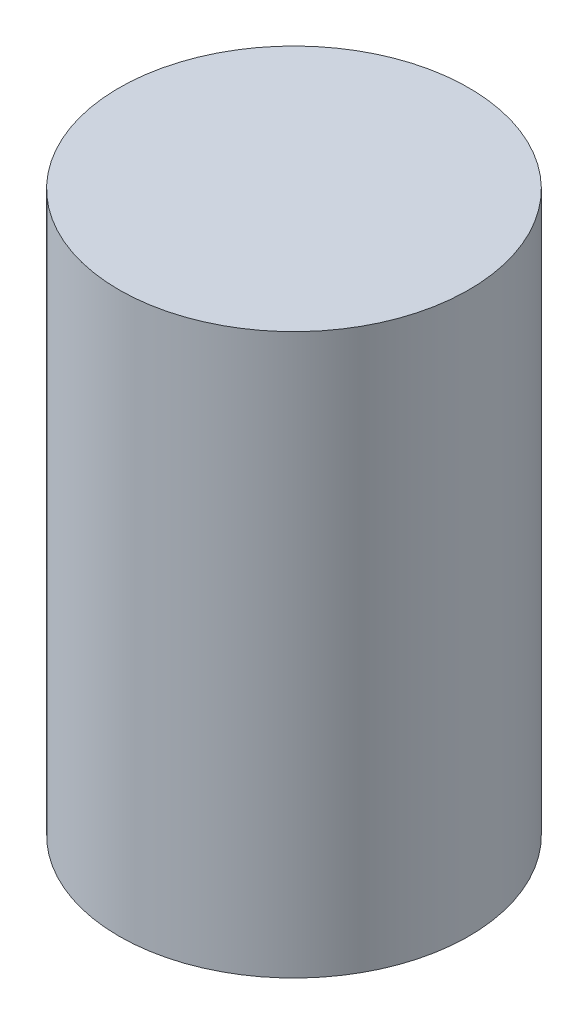
ISO-10303-21;
HEADER;
FILE_DESCRIPTION(('STEP AP214'),'2;1');
FILE_NAME('part.step','',(''),(''),'','','');
FILE_SCHEMA(('AUTOMOTIVE_DESIGN { 1 0 10303 214 1 1 1 1 }'));
ENDSEC;
DATA;
#1=APPLICATION_CONTEXT('core data for automotive mechanical design processes');
#2=APPLICATION_PROTOCOL_DEFINITION('international standard','automotive_design',2000,#1);
#3=PRODUCT_CONTEXT('',#1,'mechanical');
#4=PRODUCT('Part','Part','',(#3));
#5=PRODUCT_RELATED_PRODUCT_CATEGORY('part','',(#4));
#6=PRODUCT_DEFINITION_FORMATION('','',#4);
#7=PRODUCT_DEFINITION_CONTEXT('part definition',#1,'design');
#8=PRODUCT_DEFINITION('design','',#6,#7);
#9=PRODUCT_DEFINITION_SHAPE('','',#8);
#10=(LENGTH_UNIT() NAMED_UNIT(*) SI_UNIT(.MILLI.,.METRE.));
#11=(NAMED_UNIT(*) PLANE_ANGLE_UNIT() SI_UNIT($,.RADIAN.));
#12=(NAMED_UNIT(*) SI_UNIT($,.STERADIAN.) SOLID_ANGLE_UNIT());
#13=UNCERTAINTY_MEASURE_WITH_UNIT(LENGTH_MEASURE(1.E-05),#10,'distance_accuracy_value','');
#14=(GEOMETRIC_REPRESENTATION_CONTEXT(3) GLOBAL_UNCERTAINTY_ASSIGNED_CONTEXT((#13)) GLOBAL_UNIT_ASSIGNED_CONTEXT((#10,
#11,#12)) REPRESENTATION_CONTEXT('',''));
#15=CARTESIAN_POINT('',(0.,0.,0.));
#16=DIRECTION('',(0.,0.,1.));
#17=DIRECTION('',(1.,0.,0.));
#18=AXIS2_PLACEMENT_3D('',#15,#16,#17);
#19=CARTESIAN_POINT('',(0.,80.,0.));
#20=DIRECTION('',(0.,-1.,0.));
#21=DIRECTION('',(0.,0.,-1.));
#22=AXIS2_PLACEMENT_3D('',#19,#20,#21);
#23=CYLINDRICAL_SURFACE('',#22,25.);
#24=CARTESIAN_POINT('',(0.,80.,0.));
#25=DIRECTION('',(0.,1.,0.));
#26=DIRECTION('',(0.,0.,1.));
#27=AXIS2_PLACEMENT_3D('',#24,#25,#26);
#28=CIRCLE('',#27,25.);
#29=CARTESIAN_POINT('',(0.,80.,25.));
#30=VERTEX_POINT('',#29);
#31=EDGE_CURVE('E48',#30,#30,#28,.T.);
#32=ORIENTED_EDGE('',*,*,#31,.F.);
#33=EDGE_LOOP('',(#32));
#34=FACE_BOUND('',#33,.T.);
#35=CARTESIAN_POINT('',(0.,0.,0.));
#36=DIRECTION('',(0.,1.,0.));
#37=DIRECTION('',(0.,0.,1.));
#38=AXIS2_PLACEMENT_3D('',#35,#36,#37);
#39=CIRCLE('',#38,25.);
#40=CARTESIAN_POINT('',(0.,0.,25.));
#41=VERTEX_POINT('',#40);
#42=EDGE_CURVE('E53',#41,#41,#39,.T.);
#43=ORIENTED_EDGE('',*,*,#42,.T.);
#44=EDGE_LOOP('',(#43));
#45=FACE_BOUND('',#44,.T.);
#46=ADVANCED_FACE('F41',(#34,#45),#23,.T.);
#47=CARTESIAN_POINT('',(0.,80.,0.));
#48=DIRECTION('',(0.,1.,0.));
#49=DIRECTION('',(0.,0.,1.));
#50=AXIS2_PLACEMENT_3D('',#47,#48,#49);
#51=PLANE('',#50);
#52=ORIENTED_EDGE('',*,*,#31,.T.);
#53=EDGE_LOOP('',(#52));
#54=FACE_BOUND('',#53,.T.);
#55=ADVANCED_FACE('F84',(#54),#51,.T.);
#56=CARTESIAN_POINT('',(0.,0.,0.));
#57=DIRECTION('',(0.,1.,0.));
#58=DIRECTION('',(0.,0.,1.));
#59=AXIS2_PLACEMENT_3D('',#56,#57,#58);
#60=PLANE('',#59);
#61=ORIENTED_EDGE('',*,*,#42,.F.);
#62=EDGE_LOOP('',(#61));
#63=FACE_BOUND('',#62,.T.);
#64=CARTESIAN_POINT('',(0.,0.,0.));
#65=DIRECTION('',(0.,-1.,0.));
#66=DIRECTION('',(0.,0.,-1.));
#67=AXIS2_PLACEMENT_3D('',#64,#65,#66);
#68=CIRCLE('',#67,5.);
#69=CARTESIAN_POINT('',(0.,0.,-5.));
#70=VERTEX_POINT('',#69);
#71=EDGE_CURVE('E65',#70,#70,#68,.T.);
#72=ORIENTED_EDGE('',*,*,#71,.F.);
#73=EDGE_LOOP('',(#72));
#74=FACE_BOUND('',#73,.T.);
#75=ADVANCED_FACE('F82',(#63,#74),#60,.F.);
#76=CARTESIAN_POINT('',(0.,5.,0.));
#77=DIRECTION('',(0.,-1.,0.));
#78=DIRECTION('',(0.,0.,-1.));
#79=AXIS2_PLACEMENT_3D('',#76,#77,#78);
#80=PLANE('',#79);
#81=CARTESIAN_POINT('',(0.,5.,0.));
#82=DIRECTION('',(0.,-1.,0.));
#83=DIRECTION('',(0.,0.,-1.));
#84=AXIS2_PLACEMENT_3D('',#81,#82,#83);
#85=CIRCLE('',#84,5.);
#86=CARTESIAN_POINT('',(0.,5.,-5.));
#87=VERTEX_POINT('',#86);
#88=EDGE_CURVE('E64',#87,#87,#85,.T.);
#89=ORIENTED_EDGE('',*,*,#88,.T.);
#90=EDGE_LOOP('',(#89));
#91=FACE_BOUND('',#90,.T.);
#92=CARTESIAN_POINT('',(0.,5.,0.));
#93=DIRECTION('',(0.,-1.,0.));
#94=DIRECTION('',(0.,0.,-1.));
#95=AXIS2_PLACEMENT_3D('',#92,#93,#94);
#96=CIRCLE('',#95,22.);
#97=CARTESIAN_POINT('',(0.,5.,-22.));
#98=VERTEX_POINT('',#97);
#99=EDGE_CURVE('E10',#98,#98,#96,.F.);
#100=ORIENTED_EDGE('',*,*,#99,.T.);
#101=EDGE_LOOP('',(#100));
#102=FACE_BOUND('',#101,.T.);
#103=ADVANCED_FACE('F73',(#91,#102),#80,.F.);
#104=CARTESIAN_POINT('',(0.,5.,0.));
#105=DIRECTION('',(0.,-1.,0.));
#106=DIRECTION('',(0.,0.,-1.));
#107=AXIS2_PLACEMENT_3D('',#104,#105,#106);
#108=CYLINDRICAL_SURFACE('',#107,5.);
#109=ORIENTED_EDGE('',*,*,#88,.F.);
#110=EDGE_LOOP('',(#109));
#111=FACE_BOUND('',#110,.T.);
#112=ORIENTED_EDGE('',*,*,#71,.T.);
#113=EDGE_LOOP('',(#112));
#114=FACE_BOUND('',#113,.T.);
#115=ADVANCED_FACE('F75',(#111,#114),#108,.F.);
#116=CARTESIAN_POINT('',(0.,75.,0.));
#117=DIRECTION('',(0.,-1.,0.));
#118=DIRECTION('',(0.,0.,-1.));
#119=AXIS2_PLACEMENT_3D('',#116,#117,#118);
#120=PLANE('',#119);
#121=CARTESIAN_POINT('',(0.,75.,0.));
#122=DIRECTION('',(0.,-1.,0.));
#123=DIRECTION('',(0.,0.,-1.));
#124=AXIS2_PLACEMENT_3D('',#121,#122,#123);
#125=CIRCLE('',#124,22.);
#126=CARTESIAN_POINT('',(0.,75.,-22.));
#127=VERTEX_POINT('',#126);
#128=EDGE_CURVE('E59',#127,#127,#125,.T.);
#129=ORIENTED_EDGE('',*,*,#128,.T.);
#130=EDGE_LOOP('',(#129));
#131=FACE_BOUND('',#130,.T.);
#132=ADVANCED_FACE('F78',(#131),#120,.T.);
#133=CARTESIAN_POINT('',(0.,75.,0.));
#134=DIRECTION('',(0.,-1.,0.));
#135=DIRECTION('',(0.,0.,-1.));
#136=AXIS2_PLACEMENT_3D('',#133,#134,#135);
#137=CYLINDRICAL_SURFACE('',#136,22.);
#138=ORIENTED_EDGE('',*,*,#128,.F.);
#139=EDGE_LOOP('',(#138));
#140=FACE_BOUND('',#139,.T.);
#141=ORIENTED_EDGE('',*,*,#99,.F.);
#142=EDGE_LOOP('',(#141));
#143=FACE_BOUND('',#142,.T.);
#144=ADVANCED_FACE('F112',(#140,#143),#137,.F.);
#145=CLOSED_SHELL('',(#46,#55,#75,#103,#115,#132,#144));
#146=MANIFOLD_SOLID_BREP('B2',#145);
#147=ADVANCED_BREP_SHAPE_REPRESENTATION('',(#18,#146),#14);
#148=SHAPE_DEFINITION_REPRESENTATION(#9,#147);
ENDSEC;
END-ISO-10303-21;
